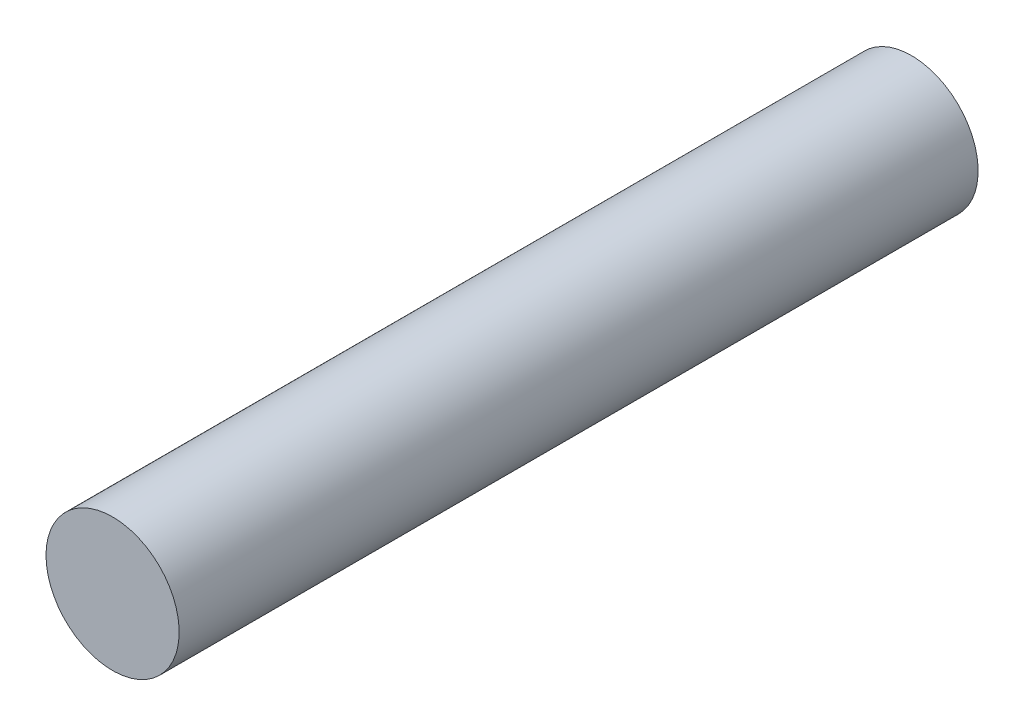
ISO-10303-21;
HEADER;
FILE_DESCRIPTION(('STEP AP214'),'2;1');
FILE_NAME('part.step','',(''),(''),'','','');
FILE_SCHEMA(('AUTOMOTIVE_DESIGN { 1 0 10303 214 1 1 1 1 }'));
ENDSEC;
DATA;
#1=APPLICATION_CONTEXT('core data for automotive mechanical design processes');
#2=APPLICATION_PROTOCOL_DEFINITION('international standard','automotive_design',2000,#1);
#3=PRODUCT_CONTEXT('',#1,'mechanical');
#4=PRODUCT('Part','Part','',(#3));
#5=PRODUCT_RELATED_PRODUCT_CATEGORY('part','',(#4));
#6=PRODUCT_DEFINITION_FORMATION('','',#4);
#7=PRODUCT_DEFINITION_CONTEXT('part definition',#1,'design');
#8=PRODUCT_DEFINITION('design','',#6,#7);
#9=PRODUCT_DEFINITION_SHAPE('','',#8);
#10=(LENGTH_UNIT() NAMED_UNIT(*) SI_UNIT(.MILLI.,.METRE.));
#11=(NAMED_UNIT(*) PLANE_ANGLE_UNIT() SI_UNIT($,.RADIAN.));
#12=(NAMED_UNIT(*) SI_UNIT($,.STERADIAN.) SOLID_ANGLE_UNIT());
#13=UNCERTAINTY_MEASURE_WITH_UNIT(LENGTH_MEASURE(1.E-05),#10,'distance_accuracy_value','');
#14=(GEOMETRIC_REPRESENTATION_CONTEXT(3) GLOBAL_UNCERTAINTY_ASSIGNED_CONTEXT((#13)) GLOBAL_UNIT_ASSIGNED_CONTEXT((#10,
#11,#12)) REPRESENTATION_CONTEXT('',''));
#15=CARTESIAN_POINT('',(0.,0.,0.));
#16=DIRECTION('',(0.,0.,1.));
#17=DIRECTION('',(1.,0.,0.));
#18=AXIS2_PLACEMENT_3D('',#15,#16,#17);
#19=CARTESIAN_POINT('',(0.,0.,152.4));
#20=DIRECTION('',(0.,0.,-1.));
#21=DIRECTION('',(-1.,0.,0.));
#22=AXIS2_PLACEMENT_3D('',#19,#20,#21);
#23=CYLINDRICAL_SURFACE('',#22,12.7);
#24=CARTESIAN_POINT('',(0.,0.,152.4));
#25=DIRECTION('',(0.,0.,1.));
#26=DIRECTION('',(1.,0.,0.));
#27=AXIS2_PLACEMENT_3D('',#24,#25,#26);
#28=CIRCLE('',#27,12.7);
#29=CARTESIAN_POINT('',(-12.7,0.,152.4));
#30=VERTEX_POINT('',#29);
#31=EDGE_CURVE('E10',#30,#30,#28,.T.);
#32=CARTESIAN_POINT('',(0.,0.,0.));
#33=DIRECTION('',(0.,0.,1.));
#34=DIRECTION('',(1.,0.,0.));
#35=AXIS2_PLACEMENT_3D('',#32,#33,#34);
#36=CIRCLE('',#35,12.7);
#37=CARTESIAN_POINT('',(-12.7,0.,0.));
#38=VERTEX_POINT('',#37);
#39=EDGE_CURVE('E40',#38,#38,#36,.T.);
#40=CARTESIAN_POINT('',(-12.7,0.,152.4));
#41=CARTESIAN_POINT('',(-12.7,0.,150.8125));
#42=CARTESIAN_POINT('',(-12.7,0.,149.225));
#43=CARTESIAN_POINT('',(-12.7,0.,146.05));
#44=CARTESIAN_POINT('',(-12.7,0.,144.4625));
#45=CARTESIAN_POINT('',(-12.7,0.,141.2875));
#46=CARTESIAN_POINT('',(-12.7,0.,139.7));
#47=CARTESIAN_POINT('',(-12.7,0.,136.525));
#48=CARTESIAN_POINT('',(-12.7,0.,134.9375));
#49=CARTESIAN_POINT('',(-12.7,0.,131.7625));
#50=CARTESIAN_POINT('',(-12.7,0.,130.175));
#51=CARTESIAN_POINT('',(-12.7,0.,127.));
#52=CARTESIAN_POINT('',(-12.7,0.,125.4125));
#53=CARTESIAN_POINT('',(-12.7,0.,122.2375));
#54=CARTESIAN_POINT('',(-12.7,0.,120.65));
#55=CARTESIAN_POINT('',(-12.7,0.,117.475));
#56=CARTESIAN_POINT('',(-12.7,0.,115.8875));
#57=CARTESIAN_POINT('',(-12.7,0.,112.7125));
#58=CARTESIAN_POINT('',(-12.7,0.,111.125));
#59=CARTESIAN_POINT('',(-12.7,0.,107.95));
#60=CARTESIAN_POINT('',(-12.7,0.,106.3625));
#61=CARTESIAN_POINT('',(-12.7,0.,103.1875));
#62=CARTESIAN_POINT('',(-12.7,0.,101.6));
#63=CARTESIAN_POINT('',(-12.7,0.,98.425));
#64=CARTESIAN_POINT('',(-12.7,0.,96.8375));
#65=CARTESIAN_POINT('',(-12.7,0.,93.6625));
#66=CARTESIAN_POINT('',(-12.7,0.,92.075));
#67=CARTESIAN_POINT('',(-12.7,0.,88.9));
#68=CARTESIAN_POINT('',(-12.7,0.,87.3125));
#69=CARTESIAN_POINT('',(-12.7,0.,84.1375));
#70=CARTESIAN_POINT('',(-12.7,0.,82.55));
#71=CARTESIAN_POINT('',(-12.7,0.,79.375));
#72=CARTESIAN_POINT('',(-12.7,0.,77.7875));
#73=CARTESIAN_POINT('',(-12.7,0.,74.6125));
#74=CARTESIAN_POINT('',(-12.7,0.,73.025));
#75=CARTESIAN_POINT('',(-12.7,0.,69.85));
#76=CARTESIAN_POINT('',(-12.7,0.,68.2625));
#77=CARTESIAN_POINT('',(-12.7,0.,65.0875));
#78=CARTESIAN_POINT('',(-12.7,0.,63.5));
#79=CARTESIAN_POINT('',(-12.7,0.,60.325));
#80=CARTESIAN_POINT('',(-12.7,0.,58.7375));
#81=CARTESIAN_POINT('',(-12.7,0.,55.5625));
#82=CARTESIAN_POINT('',(-12.7,0.,53.975));
#83=CARTESIAN_POINT('',(-12.7,0.,50.8));
#84=CARTESIAN_POINT('',(-12.7,0.,49.2125));
#85=CARTESIAN_POINT('',(-12.7,0.,46.0375));
#86=CARTESIAN_POINT('',(-12.7,0.,44.45));
#87=CARTESIAN_POINT('',(-12.7,0.,41.275));
#88=CARTESIAN_POINT('',(-12.7,0.,39.6875));
#89=CARTESIAN_POINT('',(-12.7,0.,36.5125));
#90=CARTESIAN_POINT('',(-12.7,0.,34.925));
#91=CARTESIAN_POINT('',(-12.7,0.,31.75));
#92=CARTESIAN_POINT('',(-12.7,0.,30.1625));
#93=CARTESIAN_POINT('',(-12.7,0.,26.9875));
#94=CARTESIAN_POINT('',(-12.7,0.,25.4));
#95=CARTESIAN_POINT('',(-12.7,0.,22.225));
#96=CARTESIAN_POINT('',(-12.7,0.,20.6375));
#97=CARTESIAN_POINT('',(-12.7,0.,17.4625));
#98=CARTESIAN_POINT('',(-12.7,0.,15.875));
#99=CARTESIAN_POINT('',(-12.7,0.,12.7));
#100=CARTESIAN_POINT('',(-12.7,0.,11.1125));
#101=CARTESIAN_POINT('',(-12.7,0.,7.93750000000001));
#102=CARTESIAN_POINT('',(-12.7,0.,6.35));
#103=CARTESIAN_POINT('',(-12.7,0.,3.175));
#104=CARTESIAN_POINT('',(-12.7,0.,1.5875));
#105=CARTESIAN_POINT('',(-12.7,0.,0.));
#106=B_SPLINE_CURVE_WITH_KNOTS('',3,(#40,#41,#42,#43,#44,#45,#46,#47,#48,#49,#50,#51,#52,#53,
#54,#55,#56,#57,#58,#59,#60,#61,#62,#63,#64,#65,#66,#67,#68,#69,#70,#71,#72,#73,#74,#75,#76,#77,
#78,#79,#80,#81,#82,#83,#84,#85,#86,#87,#88,#89,#90,#91,#92,#93,#94,#95,#96,#97,#98,#99,#100,
#101,#102,#103,#104,#105),.UNSPECIFIED.,.F.,.F.,(4,2,2,2,2,2,2,2,2,2,2,2,2,2,2,2,2,2,2,2,2,2,2,
2,2,2,2,2,2,2,2,2,4),(0.,4.76249999999998,9.52499999999998,14.2875,19.05,23.8125,28.575,33.3375,
38.1,42.8625,47.625,52.3875,57.15,61.9125,66.675,71.4375,76.2,80.9625,85.725,90.4875,95.25,
100.0125,104.775,109.5375,114.3,119.0625,123.825,128.5875,133.35,138.1125,142.875,147.6375,
152.4),.UNSPECIFIED.);
#107=EDGE_CURVE('BSEAM37',#30,#38,#106,.T.);
#108=ORIENTED_EDGE('',*,*,#31,.F.);
#109=ORIENTED_EDGE('',*,*,#39,.T.);
#110=ORIENTED_EDGE('',*,*,#107,.T.);
#111=ORIENTED_EDGE('',*,*,#107,.F.);
#112=EDGE_LOOP('',(#108,#110,#109,#111));
#113=FACE_BOUND('',#112,.T.);
#114=ADVANCED_FACE('F37',(#113),#23,.T.);
#115=CARTESIAN_POINT('',(0.,0.,152.4));
#116=DIRECTION('',(0.,0.,1.));
#117=DIRECTION('',(1.,0.,0.));
#118=AXIS2_PLACEMENT_3D('',#115,#116,#117);
#119=PLANE('',#118);
#120=ORIENTED_EDGE('',*,*,#31,.T.);
#121=EDGE_LOOP('',(#120));
#122=FACE_BOUND('',#121,.T.);
#123=ADVANCED_FACE('F54',(#122),#119,.T.);
#124=CARTESIAN_POINT('',(0.,0.,0.));
#125=DIRECTION('',(0.,0.,1.));
#126=DIRECTION('',(1.,0.,0.));
#127=AXIS2_PLACEMENT_3D('',#124,#125,#126);
#128=PLANE('',#127);
#129=ORIENTED_EDGE('',*,*,#39,.F.);
#130=EDGE_LOOP('',(#129));
#131=FACE_BOUND('',#130,.T.);
#132=ADVANCED_FACE('F52',(#131),#128,.F.);
#133=CLOSED_SHELL('',(#114,#123,#132));
#134=MANIFOLD_SOLID_BREP('B2',#133);
#135=ADVANCED_BREP_SHAPE_REPRESENTATION('',(#18,#134),#14);
#136=SHAPE_DEFINITION_REPRESENTATION(#9,#135);
ENDSEC;
END-ISO-10303-21;
